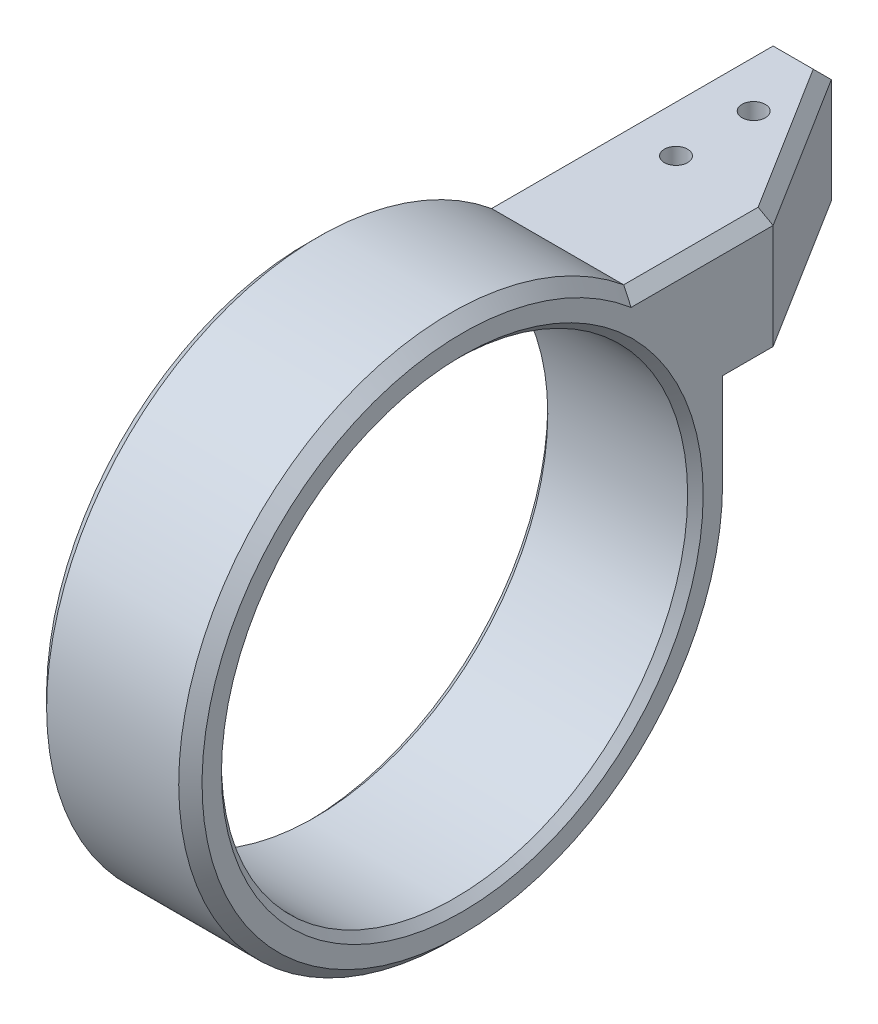
ISO-10303-21;
HEADER;
FILE_DESCRIPTION(('STEP AP214'),'2;1');
FILE_NAME('part.step','',(''),(''),'','','');
FILE_SCHEMA(('AUTOMOTIVE_DESIGN { 1 0 10303 214 1 1 1 1 }'));
ENDSEC;
DATA;
#1=APPLICATION_CONTEXT('core data for automotive mechanical design processes');
#2=APPLICATION_PROTOCOL_DEFINITION('international standard','automotive_design',2000,#1);
#3=PRODUCT_CONTEXT('',#1,'mechanical');
#4=PRODUCT('Part','Part','',(#3));
#5=PRODUCT_RELATED_PRODUCT_CATEGORY('part','',(#4));
#6=PRODUCT_DEFINITION_FORMATION('','',#4);
#7=PRODUCT_DEFINITION_CONTEXT('part definition',#1,'design');
#8=PRODUCT_DEFINITION('design','',#6,#7);
#9=PRODUCT_DEFINITION_SHAPE('','',#8);
#10=(LENGTH_UNIT() NAMED_UNIT(*) SI_UNIT(.MILLI.,.METRE.));
#11=(NAMED_UNIT(*) PLANE_ANGLE_UNIT() SI_UNIT($,.RADIAN.));
#12=(NAMED_UNIT(*) SI_UNIT($,.STERADIAN.) SOLID_ANGLE_UNIT());
#13=UNCERTAINTY_MEASURE_WITH_UNIT(LENGTH_MEASURE(1.E-05),#10,'distance_accuracy_value','');
#14=(GEOMETRIC_REPRESENTATION_CONTEXT(3) GLOBAL_UNCERTAINTY_ASSIGNED_CONTEXT((#13)) GLOBAL_UNIT_ASSIGNED_CONTEXT((#10,
#11,#12)) REPRESENTATION_CONTEXT('',''));
#15=CARTESIAN_POINT('',(0.,0.,0.));
#16=DIRECTION('',(0.,0.,1.));
#17=DIRECTION('',(1.,0.,0.));
#18=AXIS2_PLACEMENT_3D('',#15,#16,#17);
#19=CARTESIAN_POINT('',(20.,0.,0.));
#20=DIRECTION('',(-1.,0.,0.));
#21=DIRECTION('',(0.,0.,1.));
#22=AXIS2_PLACEMENT_3D('',#19,#20,#21);
#23=CYLINDRICAL_SURFACE('',#22,35.);
#24=DIRECTION('',(-1.,0.,0.));
#25=VECTOR('',#24,1.);
#26=CARTESIAN_POINT('',(20.,27.,-22.2710574513201));
#27=LINE('',#26,#25);
#28=CARTESIAN_POINT('',(1.50000000000001,27.,-22.2710574513201));
#29=VERTEX_POINT('',#28);
#30=CARTESIAN_POINT('',(18.5,27.,-22.2710574513201));
#31=VERTEX_POINT('',#30);
#32=EDGE_CURVE('E148',#29,#31,#27,.F.);
#33=ORIENTED_EDGE('',*,*,#32,.F.);
#34=CARTESIAN_POINT('',(1.50000000000003,0.,0.));
#35=DIRECTION('',(1.,0.,0.));
#36=DIRECTION('',(0.,0.,-1.));
#37=AXIS2_PLACEMENT_3D('',#34,#35,#36);
#38=CIRCLE('',#37,35.);
#39=CARTESIAN_POINT('',(1.50000000000003,0.,-35.));
#40=VERTEX_POINT('',#39);
#41=EDGE_CURVE('E211',#29,#40,#38,.T.);
#42=ORIENTED_EDGE('',*,*,#41,.T.);
#43=DIRECTION('',(-1.,0.,0.));
#44=VECTOR('',#43,1.);
#45=CARTESIAN_POINT('',(0.,0.,-35.));
#46=LINE('',#45,#44);
#47=CARTESIAN_POINT('',(18.5,0.,-35.));
#48=VERTEX_POINT('',#47);
#49=EDGE_CURVE('E141',#48,#40,#46,.T.);
#50=ORIENTED_EDGE('',*,*,#49,.F.);
#51=CARTESIAN_POINT('',(18.5,0.,0.));
#52=DIRECTION('',(1.,0.,0.));
#53=DIRECTION('',(0.,0.,-1.));
#54=AXIS2_PLACEMENT_3D('',#51,#52,#53);
#55=CIRCLE('',#54,35.);
#56=EDGE_CURVE('E208',#48,#31,#55,.F.);
#57=ORIENTED_EDGE('',*,*,#56,.T.);
#58=EDGE_LOOP('',(#33,#42,#50,#57));
#59=FACE_BOUND('',#58,.T.);
#60=ADVANCED_FACE('F38',(#59),#23,.T.);
#61=CARTESIAN_POINT('',(0.,0.,0.));
#62=DIRECTION('',(1.,0.,0.));
#63=DIRECTION('',(0.,0.,-1.));
#64=AXIS2_PLACEMENT_3D('',#61,#62,#63);
#65=CYLINDRICAL_SURFACE('',#64,30.);
#66=CARTESIAN_POINT('',(0.999999999999994,0.,0.));
#67=DIRECTION('',(1.,0.,0.));
#68=DIRECTION('',(0.,0.,-1.));
#69=AXIS2_PLACEMENT_3D('',#66,#67,#68);
#70=CIRCLE('',#69,30.);
#71=CARTESIAN_POINT('',(0.999999999999994,0.,-30.));
#72=VERTEX_POINT('',#71);
#73=EDGE_CURVE('E176',#72,#72,#70,.F.);
#74=ORIENTED_EDGE('',*,*,#73,.T.);
#75=EDGE_LOOP('',(#74));
#76=FACE_BOUND('',#75,.T.);
#77=CARTESIAN_POINT('',(19.,0.,0.));
#78=DIRECTION('',(1.,0.,0.));
#79=DIRECTION('',(0.,0.,-1.));
#80=AXIS2_PLACEMENT_3D('',#77,#78,#79);
#81=CIRCLE('',#80,30.);
#82=CARTESIAN_POINT('',(19.,0.,-30.));
#83=VERTEX_POINT('',#82);
#84=EDGE_CURVE('E172',#83,#83,#81,.T.);
#85=ORIENTED_EDGE('',*,*,#84,.T.);
#86=EDGE_LOOP('',(#85));
#87=FACE_BOUND('',#86,.T.);
#88=ADVANCED_FACE('F337',(#76,#87),#65,.F.);
#89=CARTESIAN_POINT('',(20.,0.,0.));
#90=DIRECTION('',(1.,0.,0.));
#91=DIRECTION('',(0.,0.,-1.));
#92=AXIS2_PLACEMENT_3D('',#89,#90,#91);
#93=PLANE('',#92);
#94=CARTESIAN_POINT('',(20.,0.,0.));
#95=DIRECTION('',(1.,0.,0.));
#96=DIRECTION('',(0.,0.,-1.));
#97=AXIS2_PLACEMENT_3D('',#94,#95,#96);
#98=CIRCLE('',#97,31.);
#99=CARTESIAN_POINT('',(20.,0.,-31.));
#100=VERTEX_POINT('',#99);
#101=EDGE_CURVE('E180',#100,#100,#98,.F.);
#102=ORIENTED_EDGE('',*,*,#101,.T.);
#103=EDGE_LOOP('',(#102));
#104=FACE_BOUND('',#103,.T.);
#105=DIRECTION('',(0.,1.,0.));
#106=VECTOR('',#105,1.);
#107=CARTESIAN_POINT('',(20.,0.,-33.5));
#108=LINE('',#107,#106);
#109=CARTESIAN_POINT('',(20.,0.,-33.5));
#110=VERTEX_POINT('',#109);
#111=CARTESIAN_POINT('',(20.,12.,-33.5));
#112=VERTEX_POINT('',#111);
#113=EDGE_CURVE('E145',#110,#112,#108,.T.);
#114=ORIENTED_EDGE('',*,*,#113,.T.);
#115=DIRECTION('',(0.,0.,1.));
#116=VECTOR('',#115,1.);
#117=CARTESIAN_POINT('',(20.,12.,-60.));
#118=LINE('',#117,#116);
#119=CARTESIAN_POINT('',(20.,12.,-40.));
#120=VERTEX_POINT('',#119);
#121=EDGE_CURVE('E136',#120,#112,#118,.T.);
#122=ORIENTED_EDGE('',*,*,#121,.F.);
#123=DIRECTION('',(0.,1.,0.));
#124=VECTOR('',#123,1.);
#125=CARTESIAN_POINT('',(20.,-35.001,-40.));
#126=LINE('',#125,#124);
#127=CARTESIAN_POINT('',(20.,25.5,-40.));
#128=VERTEX_POINT('',#127);
#129=EDGE_CURVE('E121',#120,#128,#126,.T.);
#130=ORIENTED_EDGE('',*,*,#129,.T.);
#131=DIRECTION('',(0.,0.,1.));
#132=VECTOR('',#131,1.);
#133=CARTESIAN_POINT('',(20.,25.5,-22.2710574513201));
#134=LINE('',#133,#132);
#135=CARTESIAN_POINT('',(20.,25.5,-21.7255609824004));
#136=VERTEX_POINT('',#135);
#137=EDGE_CURVE('E203',#128,#136,#134,.T.);
#138=ORIENTED_EDGE('',*,*,#137,.T.);
#139=CARTESIAN_POINT('',(20.,0.,0.));
#140=DIRECTION('',(1.,0.,0.));
#141=DIRECTION('',(0.,0.,-1.));
#142=AXIS2_PLACEMENT_3D('',#139,#140,#141);
#143=CIRCLE('',#142,33.5);
#144=EDGE_CURVE('E200',#136,#110,#143,.T.);
#145=ORIENTED_EDGE('',*,*,#144,.T.);
#146=EDGE_LOOP('',(#114,#122,#130,#138,#145));
#147=FACE_BOUND('',#146,.T.);
#148=ADVANCED_FACE('F143',(#104,#147),#93,.T.);
#149=CARTESIAN_POINT('',(0.,0.,0.));
#150=DIRECTION('',(1.,0.,0.));
#151=DIRECTION('',(0.,0.,-1.));
#152=AXIS2_PLACEMENT_3D('',#149,#150,#151);
#153=PLANE('',#152);
#154=CARTESIAN_POINT('',(0.,0.,0.));
#155=DIRECTION('',(1.,0.,0.));
#156=DIRECTION('',(0.,0.,-1.));
#157=AXIS2_PLACEMENT_3D('',#154,#155,#156);
#158=CIRCLE('',#157,31.);
#159=CARTESIAN_POINT('',(0.,0.,-31.));
#160=VERTEX_POINT('',#159);
#161=EDGE_CURVE('E154',#160,#160,#158,.T.);
#162=ORIENTED_EDGE('',*,*,#161,.T.);
#163=EDGE_LOOP('',(#162));
#164=FACE_BOUND('',#163,.T.);
#165=DIRECTION('',(0.,0.,1.));
#166=VECTOR('',#165,1.);
#167=CARTESIAN_POINT('',(0.,12.,-60.));
#168=LINE('',#167,#166);
#169=CARTESIAN_POINT('',(0.,12.,-60.));
#170=VERTEX_POINT('',#169);
#171=CARTESIAN_POINT('',(0.,12.,-33.5));
#172=VERTEX_POINT('',#171);
#173=EDGE_CURVE('E149',#170,#172,#168,.T.);
#174=ORIENTED_EDGE('',*,*,#173,.T.);
#175=DIRECTION('',(0.,-1.,0.));
#176=VECTOR('',#175,1.);
#177=CARTESIAN_POINT('',(0.,0.,-33.5));
#178=LINE('',#177,#176);
#179=CARTESIAN_POINT('',(0.,0.,-33.5));
#180=VERTEX_POINT('',#179);
#181=EDGE_CURVE('E197',#172,#180,#178,.T.);
#182=ORIENTED_EDGE('',*,*,#181,.T.);
#183=CARTESIAN_POINT('',(0.,0.,0.));
#184=DIRECTION('',(1.,0.,0.));
#185=DIRECTION('',(0.,0.,-1.));
#186=AXIS2_PLACEMENT_3D('',#183,#184,#185);
#187=CIRCLE('',#186,33.5);
#188=CARTESIAN_POINT('',(0.,25.5,-21.7255609824005));
#189=VERTEX_POINT('',#188);
#190=EDGE_CURVE('E194',#180,#189,#187,.F.);
#191=ORIENTED_EDGE('',*,*,#190,.T.);
#192=DIRECTION('',(0.,0.,-1.));
#193=VECTOR('',#192,1.);
#194=CARTESIAN_POINT('',(0.,25.5,0.));
#195=LINE('',#194,#193);
#196=CARTESIAN_POINT('',(0.,25.5,-60.));
#197=VERTEX_POINT('',#196);
#198=EDGE_CURVE('E191',#189,#197,#195,.T.);
#199=ORIENTED_EDGE('',*,*,#198,.T.);
#200=DIRECTION('',(0.,1.,0.));
#201=VECTOR('',#200,1.);
#202=CARTESIAN_POINT('',(0.,12.,-60.));
#203=LINE('',#202,#201);
#204=EDGE_CURVE('E156',#170,#197,#203,.T.);
#205=ORIENTED_EDGE('',*,*,#204,.F.);
#206=EDGE_LOOP('',(#174,#182,#191,#199,#205));
#207=FACE_BOUND('',#206,.T.);
#208=ADVANCED_FACE('F324',(#164,#207),#153,.F.);
#209=CARTESIAN_POINT('',(0.,12.,-60.));
#210=DIRECTION('',(0.,1.,0.));
#211=DIRECTION('',(-1.,0.,0.));
#212=AXIS2_PLACEMENT_3D('',#209,#210,#211);
#213=PLANE('',#212);
#214=CARTESIAN_POINT('',(7.5,12.,-40.));
#215=DIRECTION('',(0.,-1.,0.));
#216=DIRECTION('',(1.,0.,0.));
#217=AXIS2_PLACEMENT_3D('',#214,#215,#216);
#218=CIRCLE('',#217,1.5);
#219=CARTESIAN_POINT('',(9.,12.,-40.));
#220=VERTEX_POINT('',#219);
#221=EDGE_CURVE('E165',#220,#220,#218,.T.);
#222=ORIENTED_EDGE('',*,*,#221,.F.);
#223=EDGE_LOOP('',(#222));
#224=FACE_BOUND('',#223,.T.);
#225=CARTESIAN_POINT('',(7.5,12.,-50.));
#226=DIRECTION('',(0.,-1.,0.));
#227=DIRECTION('',(1.,0.,0.));
#228=AXIS2_PLACEMENT_3D('',#225,#226,#227);
#229=CIRCLE('',#228,1.5);
#230=CARTESIAN_POINT('',(9.,12.,-50.));
#231=VERTEX_POINT('',#230);
#232=EDGE_CURVE('E396',#231,#231,#229,.T.);
#233=ORIENTED_EDGE('',*,*,#232,.F.);
#234=EDGE_LOOP('',(#233));
#235=FACE_BOUND('',#234,.T.);
#236=DIRECTION('',(-1.,0.,0.));
#237=VECTOR('',#236,1.);
#238=CARTESIAN_POINT('',(0.,12.,-60.));
#239=LINE('',#238,#237);
#240=CARTESIAN_POINT('',(7.5,12.,-60.));
#241=VERTEX_POINT('',#240);
#242=EDGE_CURVE('E139',#241,#170,#239,.T.);
#243=ORIENTED_EDGE('',*,*,#242,.F.);
#244=DIRECTION('',(-0.52999894000318,0.,-0.847998304005088));
#245=VECTOR('',#244,1.);
#246=CARTESIAN_POINT('',(7.5,12.,-60.));
#247=LINE('',#246,#245);
#248=EDGE_CURVE('E124',#120,#241,#247,.T.);
#249=ORIENTED_EDGE('',*,*,#248,.F.);
#250=ORIENTED_EDGE('',*,*,#121,.T.);
#251=DIRECTION('',(0.707106781186551,0.,0.707106781186544));
#252=VECTOR('',#251,1.);
#253=CARTESIAN_POINT('',(-3.2500000000001,12.,-56.7499999999999));
#254=LINE('',#253,#252);
#255=CARTESIAN_POINT('',(18.5,12.,-35.));
#256=VERTEX_POINT('',#255);
#257=EDGE_CURVE('E11',#112,#256,#254,.F.);
#258=ORIENTED_EDGE('',*,*,#257,.T.);
#259=DIRECTION('',(1.,0.,0.));
#260=VECTOR('',#259,1.);
#261=CARTESIAN_POINT('',(0.,12.,-35.));
#262=LINE('',#261,#260);
#263=CARTESIAN_POINT('',(1.50000000000003,12.,-35.));
#264=VERTEX_POINT('',#263);
#265=EDGE_CURVE('E309',#264,#256,#262,.T.);
#266=ORIENTED_EDGE('',*,*,#265,.F.);
#267=DIRECTION('',(-0.707106781186551,0.,0.707106781186544));
#268=VECTOR('',#267,1.);
#269=CARTESIAN_POINT('',(13.25,12.,-46.7499999999999));
#270=LINE('',#269,#268);
#271=EDGE_CURVE('E48',#264,#172,#270,.T.);
#272=ORIENTED_EDGE('',*,*,#271,.T.);
#273=ORIENTED_EDGE('',*,*,#173,.F.);
#274=EDGE_LOOP('',(#243,#249,#250,#258,#266,#272,#273));
#275=FACE_BOUND('',#274,.T.);
#276=ADVANCED_FACE('F135',(#224,#235,#275),#213,.F.);
#277=CARTESIAN_POINT('',(0.,27.,-60.));
#278=DIRECTION('',(0.,-1.,0.));
#279=DIRECTION('',(1.,0.,0.));
#280=AXIS2_PLACEMENT_3D('',#277,#278,#279);
#281=PLANE('',#280);
#282=CARTESIAN_POINT('',(7.5,27.,-40.));
#283=DIRECTION('',(0.,-1.,0.));
#284=DIRECTION('',(1.,0.,0.));
#285=AXIS2_PLACEMENT_3D('',#282,#283,#284);
#286=CIRCLE('',#285,1.5);
#287=CARTESIAN_POINT('',(9.,27.,-40.));
#288=VERTEX_POINT('',#287);
#289=EDGE_CURVE('E164',#288,#288,#286,.T.);
#290=ORIENTED_EDGE('',*,*,#289,.T.);
#291=EDGE_LOOP('',(#290));
#292=FACE_BOUND('',#291,.T.);
#293=CARTESIAN_POINT('',(7.5,27.,-50.));
#294=DIRECTION('',(0.,-1.,0.));
#295=DIRECTION('',(1.,0.,0.));
#296=AXIS2_PLACEMENT_3D('',#293,#294,#295);
#297=CIRCLE('',#296,1.5);
#298=CARTESIAN_POINT('',(9.,27.,-50.));
#299=VERTEX_POINT('',#298);
#300=EDGE_CURVE('E160',#299,#299,#297,.T.);
#301=ORIENTED_EDGE('',*,*,#300,.T.);
#302=EDGE_LOOP('',(#301));
#303=FACE_BOUND('',#302,.T.);
#304=DIRECTION('',(-1.,0.,0.));
#305=VECTOR('',#304,1.);
#306=CARTESIAN_POINT('',(0.,27.,-58.5));
#307=LINE('',#306,#305);
#308=CARTESIAN_POINT('',(6.66862853773937,27.,-58.5));
#309=VERTEX_POINT('',#308);
#310=CARTESIAN_POINT('',(1.50000000000001,27.,-58.5));
#311=VERTEX_POINT('',#310);
#312=EDGE_CURVE('E64',#309,#311,#307,.T.);
#313=ORIENTED_EDGE('',*,*,#312,.T.);
#314=DIRECTION('',(0.,0.,1.));
#315=VECTOR('',#314,1.);
#316=CARTESIAN_POINT('',(1.50000000000001,27.,-60.));
#317=LINE('',#316,#315);
#318=EDGE_CURVE('E222',#311,#29,#317,.T.);
#319=ORIENTED_EDGE('',*,*,#318,.T.);
#320=ORIENTED_EDGE('',*,*,#32,.T.);
#321=DIRECTION('',(0.,0.,-1.));
#322=VECTOR('',#321,1.);
#323=CARTESIAN_POINT('',(18.5,27.,-40.));
#324=LINE('',#323,#322);
#325=CARTESIAN_POINT('',(18.5,27.,-39.569805660383));
#326=VERTEX_POINT('',#325);
#327=EDGE_CURVE('E214',#31,#326,#324,.T.);
#328=ORIENTED_EDGE('',*,*,#327,.T.);
#329=DIRECTION('',(-0.52999894000318,0.,-0.847998304005088));
#330=VECTOR('',#329,1.);
#331=CARTESIAN_POINT('',(4.12126097095864,27.,-62.5757881068491));
#332=LINE('',#331,#330);
#333=EDGE_CURVE('E217',#326,#309,#332,.T.);
#334=ORIENTED_EDGE('',*,*,#333,.T.);
#335=EDGE_LOOP('',(#313,#319,#320,#328,#334));
#336=FACE_BOUND('',#335,.T.);
#337=ADVANCED_FACE('F292',(#292,#303,#336),#281,.F.);
#338=CARTESIAN_POINT('',(0.,0.,-60.));
#339=DIRECTION('',(0.,0.,-1.));
#340=DIRECTION('',(-1.,0.,0.));
#341=AXIS2_PLACEMENT_3D('',#338,#339,#340);
#342=PLANE('',#341);
#343=ORIENTED_EDGE('',*,*,#204,.T.);
#344=DIRECTION('',(1.,0.,0.));
#345=VECTOR('',#344,1.);
#346=CARTESIAN_POINT('',(7.5,25.5,-60.));
#347=LINE('',#346,#345);
#348=CARTESIAN_POINT('',(7.5,25.5,-60.));
#349=VERTEX_POINT('',#348);
#350=EDGE_CURVE('E56',#197,#349,#347,.T.);
#351=ORIENTED_EDGE('',*,*,#350,.T.);
#352=DIRECTION('',(0.,1.,0.));
#353=VECTOR('',#352,1.);
#354=CARTESIAN_POINT('',(7.49999999999999,-35.001,-60.));
#355=LINE('',#354,#353);
#356=EDGE_CURVE('E131',#241,#349,#355,.T.);
#357=ORIENTED_EDGE('',*,*,#356,.F.);
#358=ORIENTED_EDGE('',*,*,#242,.T.);
#359=EDGE_LOOP('',(#343,#351,#357,#358));
#360=FACE_BOUND('',#359,.T.);
#361=ADVANCED_FACE('F322',(#360),#342,.T.);
#362=CARTESIAN_POINT('',(0.,0.,-35.));
#363=DIRECTION('',(0.,0.,-1.));
#364=DIRECTION('',(-1.,0.,0.));
#365=AXIS2_PLACEMENT_3D('',#362,#363,#364);
#366=PLANE('',#365);
#367=ORIENTED_EDGE('',*,*,#49,.T.);
#368=DIRECTION('',(0.,1.,0.));
#369=VECTOR('',#368,1.);
#370=CARTESIAN_POINT('',(1.50000000000003,12.,-35.));
#371=LINE('',#370,#369);
#372=EDGE_CURVE('E187',#40,#264,#371,.T.);
#373=ORIENTED_EDGE('',*,*,#372,.T.);
#374=ORIENTED_EDGE('',*,*,#265,.T.);
#375=DIRECTION('',(0.,-1.,0.));
#376=VECTOR('',#375,1.);
#377=CARTESIAN_POINT('',(18.5,0.,-35.));
#378=LINE('',#377,#376);
#379=EDGE_CURVE('E184',#256,#48,#378,.T.);
#380=ORIENTED_EDGE('',*,*,#379,.T.);
#381=EDGE_LOOP('',(#367,#373,#374,#380));
#382=FACE_BOUND('',#381,.T.);
#383=ADVANCED_FACE('F311',(#382),#366,.T.);
#384=CARTESIAN_POINT('',(7.49999999999999,-35.001,-60.));
#385=DIRECTION('',(-0.847998304005088,0.,0.52999894000318));
#386=DIRECTION('',(0.52999894000318,0.,0.847998304005088));
#387=AXIS2_PLACEMENT_3D('',#384,#385,#386);
#388=PLANE('',#387);
#389=ORIENTED_EDGE('',*,*,#356,.T.);
#390=DIRECTION('',(0.52999894000318,0.,0.847998304005088));
#391=VECTOR('',#390,1.);
#392=CARTESIAN_POINT('',(7.5,25.5,-60.));
#393=LINE('',#392,#391);
#394=EDGE_CURVE('E126',#349,#128,#393,.T.);
#395=ORIENTED_EDGE('',*,*,#394,.T.);
#396=ORIENTED_EDGE('',*,*,#129,.F.);
#397=ORIENTED_EDGE('',*,*,#248,.T.);
#398=EDGE_LOOP('',(#389,#395,#396,#397));
#399=FACE_BOUND('',#398,.T.);
#400=ADVANCED_FACE('F123',(#399),#388,.F.);
#401=CARTESIAN_POINT('',(7.5,35.,-50.));
#402=DIRECTION('',(0.,-1.,0.));
#403=DIRECTION('',(1.,0.,0.));
#404=AXIS2_PLACEMENT_3D('',#401,#402,#403);
#405=CYLINDRICAL_SURFACE('',#404,1.5);
#406=ORIENTED_EDGE('',*,*,#232,.T.);
#407=EDGE_LOOP('',(#406));
#408=FACE_BOUND('',#407,.T.);
#409=ORIENTED_EDGE('',*,*,#300,.F.);
#410=EDGE_LOOP('',(#409));
#411=FACE_BOUND('',#410,.T.);
#412=ADVANCED_FACE('F380',(#408,#411),#405,.F.);
#413=CARTESIAN_POINT('',(7.5,35.,-40.));
#414=DIRECTION('',(0.,-1.,0.));
#415=DIRECTION('',(1.,0.,0.));
#416=AXIS2_PLACEMENT_3D('',#413,#414,#415);
#417=CYLINDRICAL_SURFACE('',#416,1.5);
#418=ORIENTED_EDGE('',*,*,#221,.T.);
#419=EDGE_LOOP('',(#418));
#420=FACE_BOUND('',#419,.T.);
#421=ORIENTED_EDGE('',*,*,#289,.F.);
#422=EDGE_LOOP('',(#421));
#423=FACE_BOUND('',#422,.T.);
#424=ADVANCED_FACE('F350',(#420,#423),#417,.F.);
#425=CARTESIAN_POINT('',(0.,0.,0.));
#426=DIRECTION('',(-1.,0.,0.));
#427=DIRECTION('',(0.,0.,1.));
#428=AXIS2_PLACEMENT_3D('',#425,#426,#427);
#429=CONICAL_SURFACE('',#428,31.,0.785398163397447);
#430=ORIENTED_EDGE('',*,*,#73,.F.);
#431=EDGE_LOOP('',(#430));
#432=FACE_BOUND('',#431,.T.);
#433=ORIENTED_EDGE('',*,*,#161,.F.);
#434=EDGE_LOOP('',(#433));
#435=FACE_BOUND('',#434,.T.);
#436=ADVANCED_FACE('F347',(#432,#435),#429,.F.);
#437=CARTESIAN_POINT('',(19.,0.,0.));
#438=DIRECTION('',(1.,0.,0.));
#439=DIRECTION('',(0.,0.,-1.));
#440=AXIS2_PLACEMENT_3D('',#437,#438,#439);
#441=CONICAL_SURFACE('',#440,30.,0.785398163397452);
#442=ORIENTED_EDGE('',*,*,#101,.F.);
#443=EDGE_LOOP('',(#442));
#444=FACE_BOUND('',#443,.T.);
#445=ORIENTED_EDGE('',*,*,#84,.F.);
#446=EDGE_LOOP('',(#445));
#447=FACE_BOUND('',#446,.T.);
#448=ADVANCED_FACE('F349',(#444,#447),#441,.F.);
#449=CARTESIAN_POINT('',(18.5,0.,-35.));
#450=DIRECTION('',(-0.707106781186544,0.,0.707106781186551));
#451=DIRECTION('',(0.,-1.,0.));
#452=AXIS2_PLACEMENT_3D('',#449,#450,#451);
#453=PLANE('',#452);
#454=ORIENTED_EDGE('',*,*,#257,.F.);
#455=ORIENTED_EDGE('',*,*,#113,.F.);
#456=DIRECTION('',(0.707106781186551,0.,0.707106781186544));
#457=VECTOR('',#456,1.);
#458=CARTESIAN_POINT('',(18.5,0.,-35.));
#459=LINE('',#458,#457);
#460=EDGE_CURVE('E42',#48,#110,#459,.T.);
#461=ORIENTED_EDGE('',*,*,#460,.F.);
#462=ORIENTED_EDGE('',*,*,#379,.F.);
#463=EDGE_LOOP('',(#454,#455,#461,#462));
#464=FACE_BOUND('',#463,.T.);
#465=ADVANCED_FACE('F40',(#464),#453,.F.);
#466=CARTESIAN_POINT('',(20.,0.,0.));
#467=DIRECTION('',(-1.,0.,0.));
#468=DIRECTION('',(0.,0.,1.));
#469=AXIS2_PLACEMENT_3D('',#466,#467,#468);
#470=CONICAL_SURFACE('',#469,33.5,0.785398163397444);
#471=ORIENTED_EDGE('',*,*,#460,.T.);
#472=ORIENTED_EDGE('',*,*,#144,.F.);
#473=CARTESIAN_POINT('',(20.,25.5,-21.7255609824004));
#474=CARTESIAN_POINT('',(19.7501922353415,25.7498077646585,-21.8175343454413));
#475=CARTESIAN_POINT('',(19.5002883468876,25.9997116531124,-21.9089790682381));
#476=CARTESIAN_POINT('',(19.0002883468687,26.4997116531312,-22.0908112244411));
#477=CARTESIAN_POINT('',(18.7501922353227,26.7498077646773,-22.1811986579508));
#478=CARTESIAN_POINT('',(18.5,27.,-22.2710574513201));
#479=B_SPLINE_CURVE_WITH_KNOTS('',3,(#473,#474,#475,#476,#477,#478),.UNSPECIFIED.,.F.,.F.,(4,2,
4),(0.,1.09516866203595,2.19033721683319),.UNSPECIFIED.);
#480=EDGE_CURVE('E270',#31,#136,#479,.F.);
#481=ORIENTED_EDGE('',*,*,#480,.F.);
#482=ORIENTED_EDGE('',*,*,#56,.F.);
#483=EDGE_LOOP('',(#471,#472,#481,#482));
#484=FACE_BOUND('',#483,.T.);
#485=ADVANCED_FACE('F267',(#484),#470,.T.);
#486=CARTESIAN_POINT('',(20.,25.5,0.));
#487=DIRECTION('',(0.707106781186543,0.707106781186552,0.));
#488=DIRECTION('',(0.,0.,-1.));
#489=AXIS2_PLACEMENT_3D('',#486,#487,#488);
#490=PLANE('',#489);
#491=ORIENTED_EDGE('',*,*,#480,.T.);
#492=ORIENTED_EDGE('',*,*,#137,.F.);
#493=DIRECTION('',(0.693000181219919,-0.693000181219911,-0.198749836876236));
#494=VECTOR('',#493,1.);
#495=CARTESIAN_POINT('',(14.4906530810936,31.0093469189063,-38.4199400936668));
#496=LINE('',#495,#494);
#497=EDGE_CURVE('E278',#326,#128,#496,.T.);
#498=ORIENTED_EDGE('',*,*,#497,.F.);
#499=ORIENTED_EDGE('',*,*,#327,.F.);
#500=EDGE_LOOP('',(#491,#492,#498,#499));
#501=FACE_BOUND('',#500,.T.);
#502=ADVANCED_FACE('F263',(#501),#490,.T.);
#503=CARTESIAN_POINT('',(7.5,25.5,-60.));
#504=DIRECTION('',(-0.599625351196685,-0.707106781186552,0.374765844497928));
#505=DIRECTION('',(0.52999894000318,0.,0.847998304005088));
#506=AXIS2_PLACEMENT_3D('',#503,#504,#505);
#507=PLANE('',#506);
#508=ORIENTED_EDGE('',*,*,#497,.T.);
#509=ORIENTED_EDGE('',*,*,#394,.F.);
#510=DIRECTION('',(0.364890142623927,-0.658352179238392,-0.6583521792384));
#511=VECTOR('',#510,1.);
#512=CARTESIAN_POINT('',(7.5,25.5,-60.));
#513=LINE('',#512,#511);
#514=EDGE_CURVE('E281',#309,#349,#513,.T.);
#515=ORIENTED_EDGE('',*,*,#514,.F.);
#516=ORIENTED_EDGE('',*,*,#333,.F.);
#517=EDGE_LOOP('',(#508,#509,#515,#516));
#518=FACE_BOUND('',#517,.T.);
#519=ADVANCED_FACE('F259',(#518),#507,.F.);
#520=CARTESIAN_POINT('',(0.,25.5,-60.));
#521=DIRECTION('',(0.,0.707106781186552,-0.707106781186543));
#522=DIRECTION('',(-1.,0.,0.));
#523=AXIS2_PLACEMENT_3D('',#520,#521,#522);
#524=PLANE('',#523);
#525=ORIENTED_EDGE('',*,*,#514,.T.);
#526=ORIENTED_EDGE('',*,*,#350,.F.);
#527=DIRECTION('',(-0.577350269189619,-0.577350269189626,-0.577350269189632));
#528=VECTOR('',#527,1.);
#529=CARTESIAN_POINT('',(0.,25.5,-60.));
#530=LINE('',#529,#528);
#531=EDGE_CURVE('E246',#311,#197,#530,.T.);
#532=ORIENTED_EDGE('',*,*,#531,.F.);
#533=ORIENTED_EDGE('',*,*,#312,.F.);
#534=EDGE_LOOP('',(#525,#526,#532,#533));
#535=FACE_BOUND('',#534,.T.);
#536=ADVANCED_FACE('F255',(#535),#524,.T.);
#537=CARTESIAN_POINT('',(1.50000000000001,27.,-60.));
#538=DIRECTION('',(0.707106781186551,-0.707106781186544,0.));
#539=DIRECTION('',(0.,0.,1.));
#540=AXIS2_PLACEMENT_3D('',#537,#538,#539);
#541=PLANE('',#540);
#542=ORIENTED_EDGE('',*,*,#531,.T.);
#543=ORIENTED_EDGE('',*,*,#198,.F.);
#544=CARTESIAN_POINT('',(0.,25.5,-21.7255609824005));
#545=CARTESIAN_POINT('',(0.249807764658484,25.7498077646585,-21.8175343454413));
#546=CARTESIAN_POINT('',(0.499711653112423,25.9997116531124,-21.9089790682381));
#547=CARTESIAN_POINT('',(0.999711653131253,26.4997116531312,-22.0908112244411));
#548=CARTESIAN_POINT('',(1.24980776467732,26.7498077646773,-22.1811986579508));
#549=CARTESIAN_POINT('',(1.50000000000002,27.,-22.2710574513201));
#550=B_SPLINE_CURVE_WITH_KNOTS('',3,(#544,#545,#546,#547,#548,#549),.UNSPECIFIED.,.F.,.F.,(4,2,
4),(0.,1.09516866203596,2.19033721683319),.UNSPECIFIED.);
#551=EDGE_CURVE('E236',#29,#189,#550,.F.);
#552=ORIENTED_EDGE('',*,*,#551,.F.);
#553=ORIENTED_EDGE('',*,*,#318,.F.);
#554=EDGE_LOOP('',(#542,#543,#552,#553));
#555=FACE_BOUND('',#554,.T.);
#556=ADVANCED_FACE('F251',(#555),#541,.F.);
#557=CARTESIAN_POINT('',(1.50000000000003,0.,0.));
#558=DIRECTION('',(1.,0.,0.));
#559=DIRECTION('',(0.,0.,-1.));
#560=AXIS2_PLACEMENT_3D('',#557,#558,#559);
#561=CONICAL_SURFACE('',#560,35.,0.785398163397444);
#562=ORIENTED_EDGE('',*,*,#551,.T.);
#563=ORIENTED_EDGE('',*,*,#190,.F.);
#564=DIRECTION('',(-0.707106781186551,0.,0.707106781186544));
#565=VECTOR('',#564,1.);
#566=CARTESIAN_POINT('',(1.50000000000003,0.,-35.));
#567=LINE('',#566,#565);
#568=EDGE_CURVE('E232',#40,#180,#567,.T.);
#569=ORIENTED_EDGE('',*,*,#568,.F.);
#570=ORIENTED_EDGE('',*,*,#41,.F.);
#571=EDGE_LOOP('',(#562,#563,#569,#570));
#572=FACE_BOUND('',#571,.T.);
#573=ADVANCED_FACE('F248',(#572),#561,.T.);
#574=CARTESIAN_POINT('',(1.50000000000003,0.,-35.));
#575=DIRECTION('',(-0.707106781186544,0.,-0.707106781186551));
#576=DIRECTION('',(0.,-1.,0.));
#577=AXIS2_PLACEMENT_3D('',#574,#575,#576);
#578=PLANE('',#577);
#579=ORIENTED_EDGE('',*,*,#568,.T.);
#580=ORIENTED_EDGE('',*,*,#181,.F.);
#581=ORIENTED_EDGE('',*,*,#271,.F.);
#582=ORIENTED_EDGE('',*,*,#372,.F.);
#583=EDGE_LOOP('',(#579,#580,#581,#582));
#584=FACE_BOUND('',#583,.T.);
#585=ADVANCED_FACE('F330',(#584),#578,.T.);
#586=CLOSED_SHELL('',(#60,#88,#148,#208,#276,#337,#361,#383,#400,#412,#424,#436,#448,#465,#485,
#502,#519,#536,#556,#573,#585));
#587=MANIFOLD_SOLID_BREP('B2',#586);
#588=ADVANCED_BREP_SHAPE_REPRESENTATION('',(#18,#587),#14);
#589=SHAPE_DEFINITION_REPRESENTATION(#9,#588);
ENDSEC;
END-ISO-10303-21;
